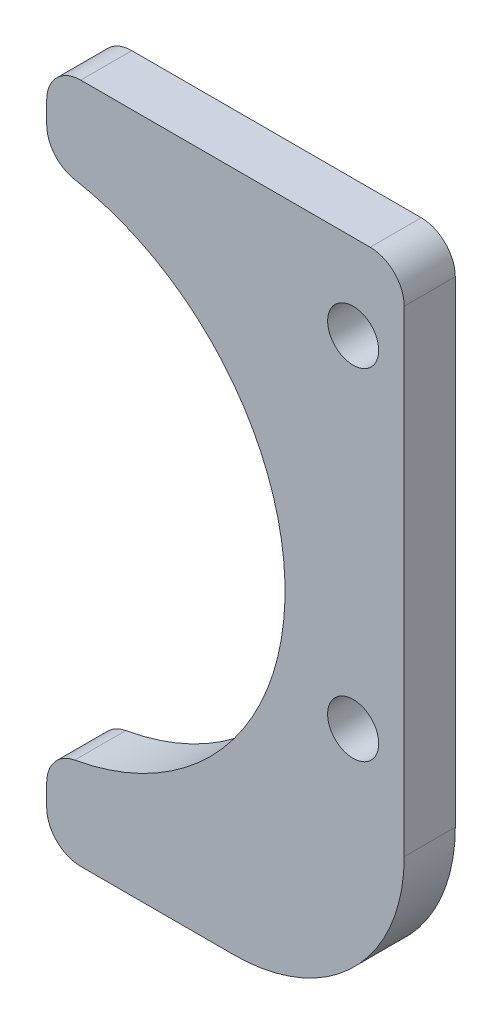
ISO-10303-21;
HEADER;
FILE_DESCRIPTION(('STEP AP214'),'2;1');
FILE_NAME('part.step','',(''),(''),'','','');
FILE_SCHEMA(('AUTOMOTIVE_DESIGN { 1 0 10303 214 1 1 1 1 }'));
ENDSEC;
DATA;
#1=APPLICATION_CONTEXT('core data for automotive mechanical design processes');
#2=APPLICATION_PROTOCOL_DEFINITION('international standard','automotive_design',2000,#1);
#3=PRODUCT_CONTEXT('',#1,'mechanical');
#4=PRODUCT('Part','Part','',(#3));
#5=PRODUCT_RELATED_PRODUCT_CATEGORY('part','',(#4));
#6=PRODUCT_DEFINITION_FORMATION('','',#4);
#7=PRODUCT_DEFINITION_CONTEXT('part definition',#1,'design');
#8=PRODUCT_DEFINITION('design','',#6,#7);
#9=PRODUCT_DEFINITION_SHAPE('','',#8);
#10=(LENGTH_UNIT() NAMED_UNIT(*) SI_UNIT(.MILLI.,.METRE.));
#11=(NAMED_UNIT(*) PLANE_ANGLE_UNIT() SI_UNIT($,.RADIAN.));
#12=(NAMED_UNIT(*) SI_UNIT($,.STERADIAN.) SOLID_ANGLE_UNIT());
#13=UNCERTAINTY_MEASURE_WITH_UNIT(LENGTH_MEASURE(1.E-05),#10,'distance_accuracy_value','');
#14=(GEOMETRIC_REPRESENTATION_CONTEXT(3) GLOBAL_UNCERTAINTY_ASSIGNED_CONTEXT((#13)) GLOBAL_UNIT_ASSIGNED_CONTEXT((#10,
#11,#12)) REPRESENTATION_CONTEXT('',''));
#15=CARTESIAN_POINT('',(0.,0.,0.));
#16=DIRECTION('',(0.,0.,1.));
#17=DIRECTION('',(1.,0.,0.));
#18=AXIS2_PLACEMENT_3D('',#15,#16,#17);
#19=CARTESIAN_POINT('',(1.00000000000001,20.,3.));
#20=DIRECTION('',(1.,0.,0.));
#21=DIRECTION('',(0.,1.,0.));
#22=AXIS2_PLACEMENT_3D('',#19,#20,#21);
#23=PLANE('',#22);
#24=DIRECTION('',(0.,-1.,0.));
#25=VECTOR('',#24,1.);
#26=CARTESIAN_POINT('',(1.00000000000001,20.,0.));
#27=LINE('',#26,#25);
#28=CARTESIAN_POINT('',(1.,18.,0.));
#29=VERTEX_POINT('',#28);
#30=CARTESIAN_POINT('',(1.,16.7332005306815,0.));
#31=VERTEX_POINT('',#30);
#32=EDGE_CURVE('E217',#29,#31,#27,.T.);
#33=ORIENTED_EDGE('',*,*,#32,.T.);
#34=DIRECTION('',(0.,0.,1.));
#35=VECTOR('',#34,1.);
#36=CARTESIAN_POINT('',(1.,16.7332005306815,3.));
#37=LINE('',#36,#35);
#38=CARTESIAN_POINT('',(1.,16.7332005306815,3.));
#39=VERTEX_POINT('',#38);
#40=EDGE_CURVE('E196',#31,#39,#37,.T.);
#41=ORIENTED_EDGE('',*,*,#40,.T.);
#42=DIRECTION('',(0.,-1.,0.));
#43=VECTOR('',#42,1.);
#44=CARTESIAN_POINT('',(1.00000000000001,20.,3.));
#45=LINE('',#44,#43);
#46=CARTESIAN_POINT('',(1.,18.,3.));
#47=VERTEX_POINT('',#46);
#48=EDGE_CURVE('E219',#47,#39,#45,.T.);
#49=ORIENTED_EDGE('',*,*,#48,.F.);
#50=DIRECTION('',(0.,0.,-1.));
#51=VECTOR('',#50,1.);
#52=CARTESIAN_POINT('',(1.,18.,0.));
#53=LINE('',#52,#51);
#54=EDGE_CURVE('E193',#47,#29,#53,.T.);
#55=ORIENTED_EDGE('',*,*,#54,.T.);
#56=EDGE_LOOP('',(#33,#41,#49,#55));
#57=FACE_BOUND('',#56,.T.);
#58=ADVANCED_FACE('F38',(#57),#23,.F.);
#59=CARTESIAN_POINT('',(0.,0.,3.));
#60=DIRECTION('',(0.,0.,-1.));
#61=DIRECTION('',(-1.,0.,0.));
#62=AXIS2_PLACEMENT_3D('',#59,#60,#61);
#63=CYLINDRICAL_SURFACE('',#62,15.);
#64=CARTESIAN_POINT('',(0.,0.,0.));
#65=DIRECTION('',(0.,0.,1.));
#66=DIRECTION('',(1.,0.,0.));
#67=AXIS2_PLACEMENT_3D('',#64,#65,#66);
#68=CIRCLE('',#67,15.);
#69=CARTESIAN_POINT('',(2.64705882352942,-14.7645887035425,0.));
#70=VERTEX_POINT('',#69);
#71=CARTESIAN_POINT('',(2.64705882352942,14.7645887035425,0.));
#72=VERTEX_POINT('',#71);
#73=EDGE_CURVE('E221',#70,#72,#68,.T.);
#74=ORIENTED_EDGE('',*,*,#73,.F.);
#75=DIRECTION('',(0.,0.,-1.));
#76=VECTOR('',#75,1.);
#77=CARTESIAN_POINT('',(2.64705882352942,-14.7645887035425,3.));
#78=LINE('',#77,#76);
#79=CARTESIAN_POINT('',(2.64705882352942,-14.7645887035425,3.));
#80=VERTEX_POINT('',#79);
#81=EDGE_CURVE('E60',#70,#80,#78,.F.);
#82=ORIENTED_EDGE('',*,*,#81,.T.);
#83=CARTESIAN_POINT('',(0.,0.,3.));
#84=DIRECTION('',(0.,0.,1.));
#85=DIRECTION('',(1.,0.,0.));
#86=AXIS2_PLACEMENT_3D('',#83,#84,#85);
#87=CIRCLE('',#86,15.);
#88=CARTESIAN_POINT('',(2.64705882352942,14.7645887035425,3.));
#89=VERTEX_POINT('',#88);
#90=EDGE_CURVE('E249',#80,#89,#87,.T.);
#91=ORIENTED_EDGE('',*,*,#90,.T.);
#92=DIRECTION('',(0.,0.,-1.));
#93=VECTOR('',#92,1.);
#94=CARTESIAN_POINT('',(2.64705882352942,14.7645887035425,3.));
#95=LINE('',#94,#93);
#96=EDGE_CURVE('E189',#89,#72,#95,.T.);
#97=ORIENTED_EDGE('',*,*,#96,.T.);
#98=EDGE_LOOP('',(#74,#82,#91,#97));
#99=FACE_BOUND('',#98,.T.);
#100=ADVANCED_FACE('F284',(#99),#63,.F.);
#101=CARTESIAN_POINT('',(1.,-14.9666295470958,3.));
#102=DIRECTION('',(1.,0.,0.));
#103=DIRECTION('',(0.,1.,0.));
#104=AXIS2_PLACEMENT_3D('',#101,#102,#103);
#105=PLANE('',#104);
#106=DIRECTION('',(0.,-1.,0.));
#107=VECTOR('',#106,1.);
#108=CARTESIAN_POINT('',(1.,-14.9666295470958,0.));
#109=LINE('',#108,#107);
#110=CARTESIAN_POINT('',(1.,-16.7332005306815,0.));
#111=VERTEX_POINT('',#110);
#112=CARTESIAN_POINT('',(1.,-18.,0.));
#113=VERTEX_POINT('',#112);
#114=EDGE_CURVE('E224',#111,#113,#109,.T.);
#115=ORIENTED_EDGE('',*,*,#114,.T.);
#116=DIRECTION('',(0.,0.,-1.));
#117=VECTOR('',#116,1.);
#118=CARTESIAN_POINT('',(1.,-18.,3.));
#119=LINE('',#118,#117);
#120=CARTESIAN_POINT('',(1.,-18.,3.));
#121=VERTEX_POINT('',#120);
#122=EDGE_CURVE('E178',#113,#121,#119,.F.);
#123=ORIENTED_EDGE('',*,*,#122,.T.);
#124=DIRECTION('',(0.,-1.,0.));
#125=VECTOR('',#124,1.);
#126=CARTESIAN_POINT('',(1.,-14.9666295470958,3.));
#127=LINE('',#126,#125);
#128=CARTESIAN_POINT('',(1.,-16.7332005306815,3.));
#129=VERTEX_POINT('',#128);
#130=EDGE_CURVE('E247',#129,#121,#127,.T.);
#131=ORIENTED_EDGE('',*,*,#130,.F.);
#132=DIRECTION('',(0.,0.,1.));
#133=VECTOR('',#132,1.);
#134=CARTESIAN_POINT('',(1.,-16.7332005306815,0.));
#135=LINE('',#134,#133);
#136=EDGE_CURVE('E175',#129,#111,#135,.F.);
#137=ORIENTED_EDGE('',*,*,#136,.T.);
#138=EDGE_LOOP('',(#115,#123,#131,#137));
#139=FACE_BOUND('',#138,.T.);
#140=ADVANCED_FACE('F241',(#139),#105,.F.);
#141=CARTESIAN_POINT('',(1.00000000000001,-20.,3.));
#142=DIRECTION('',(0.,1.,0.));
#143=DIRECTION('',(0.,0.,1.));
#144=AXIS2_PLACEMENT_3D('',#141,#142,#143);
#145=PLANE('',#144);
#146=DIRECTION('',(1.,0.,0.));
#147=VECTOR('',#146,1.);
#148=CARTESIAN_POINT('',(1.00000000000001,-20.,3.));
#149=LINE('',#148,#147);
#150=CARTESIAN_POINT('',(3.,-20.,3.));
#151=VERTEX_POINT('',#150);
#152=CARTESIAN_POINT('',(12.,-20.,3.));
#153=VERTEX_POINT('',#152);
#154=EDGE_CURVE('E246',#151,#153,#149,.T.);
#155=ORIENTED_EDGE('',*,*,#154,.F.);
#156=DIRECTION('',(0.,0.,-1.));
#157=VECTOR('',#156,1.);
#158=CARTESIAN_POINT('',(3.,-20.,3.));
#159=LINE('',#158,#157);
#160=CARTESIAN_POINT('',(3.,-20.,0.));
#161=VERTEX_POINT('',#160);
#162=EDGE_CURVE('E163',#151,#161,#159,.T.);
#163=ORIENTED_EDGE('',*,*,#162,.T.);
#164=DIRECTION('',(1.,0.,0.));
#165=VECTOR('',#164,1.);
#166=CARTESIAN_POINT('',(1.00000000000001,-20.,0.));
#167=LINE('',#166,#165);
#168=CARTESIAN_POINT('',(12.,-20.,0.));
#169=VERTEX_POINT('',#168);
#170=EDGE_CURVE('E140',#161,#169,#167,.T.);
#171=ORIENTED_EDGE('',*,*,#170,.T.);
#172=DIRECTION('',(0.,0.,-1.));
#173=VECTOR('',#172,1.);
#174=CARTESIAN_POINT('',(12.,-20.,3.));
#175=LINE('',#174,#173);
#176=EDGE_CURVE('E148',#169,#153,#175,.F.);
#177=ORIENTED_EDGE('',*,*,#176,.T.);
#178=EDGE_LOOP('',(#155,#163,#171,#177));
#179=FACE_BOUND('',#178,.T.);
#180=ADVANCED_FACE('F235',(#179),#145,.F.);
#181=CARTESIAN_POINT('',(22.,20.,3.));
#182=DIRECTION('',(1.,0.,0.));
#183=DIRECTION('',(0.,0.,-1.));
#184=AXIS2_PLACEMENT_3D('',#181,#182,#183);
#185=PLANE('',#184);
#186=DIRECTION('',(0.,-1.,0.));
#187=VECTOR('',#186,1.);
#188=CARTESIAN_POINT('',(22.,20.,0.));
#189=LINE('',#188,#187);
#190=CARTESIAN_POINT('',(22.,18.,0.));
#191=VERTEX_POINT('',#190);
#192=CARTESIAN_POINT('',(22.,-10.,0.));
#193=VERTEX_POINT('',#192);
#194=EDGE_CURVE('E128',#191,#193,#189,.T.);
#195=ORIENTED_EDGE('',*,*,#194,.F.);
#196=DIRECTION('',(0.,0.,-1.));
#197=VECTOR('',#196,1.);
#198=CARTESIAN_POINT('',(22.,18.,3.));
#199=LINE('',#198,#197);
#200=CARTESIAN_POINT('',(22.,18.,3.));
#201=VERTEX_POINT('',#200);
#202=EDGE_CURVE('E11',#191,#201,#199,.F.);
#203=ORIENTED_EDGE('',*,*,#202,.T.);
#204=DIRECTION('',(0.,-1.,0.));
#205=VECTOR('',#204,1.);
#206=CARTESIAN_POINT('',(22.,20.,3.));
#207=LINE('',#206,#205);
#208=CARTESIAN_POINT('',(22.,-10.,3.));
#209=VERTEX_POINT('',#208);
#210=EDGE_CURVE('E152',#201,#209,#207,.T.);
#211=ORIENTED_EDGE('',*,*,#210,.T.);
#212=DIRECTION('',(0.,0.,-1.));
#213=VECTOR('',#212,1.);
#214=CARTESIAN_POINT('',(22.,-10.,0.));
#215=LINE('',#214,#213);
#216=EDGE_CURVE('E146',#209,#193,#215,.T.);
#217=ORIENTED_EDGE('',*,*,#216,.T.);
#218=EDGE_LOOP('',(#195,#203,#211,#217));
#219=FACE_BOUND('',#218,.T.);
#220=ADVANCED_FACE('F150',(#219),#185,.T.);
#221=CARTESIAN_POINT('',(1.00000000000001,20.,3.));
#222=DIRECTION('',(0.,1.,0.));
#223=DIRECTION('',(0.,0.,1.));
#224=AXIS2_PLACEMENT_3D('',#221,#222,#223);
#225=PLANE('',#224);
#226=DIRECTION('',(1.,0.,0.));
#227=VECTOR('',#226,1.);
#228=CARTESIAN_POINT('',(1.00000000000001,20.,0.));
#229=LINE('',#228,#227);
#230=CARTESIAN_POINT('',(3.00000000000001,20.,0.));
#231=VERTEX_POINT('',#230);
#232=CARTESIAN_POINT('',(20.,20.,0.));
#233=VERTEX_POINT('',#232);
#234=EDGE_CURVE('E139',#231,#233,#229,.T.);
#235=ORIENTED_EDGE('',*,*,#234,.F.);
#236=DIRECTION('',(0.,0.,-1.));
#237=VECTOR('',#236,1.);
#238=CARTESIAN_POINT('',(3.,20.,3.));
#239=LINE('',#238,#237);
#240=CARTESIAN_POINT('',(3.00000000000001,20.,3.));
#241=VERTEX_POINT('',#240);
#242=EDGE_CURVE('E46',#231,#241,#239,.F.);
#243=ORIENTED_EDGE('',*,*,#242,.T.);
#244=DIRECTION('',(1.,0.,0.));
#245=VECTOR('',#244,1.);
#246=CARTESIAN_POINT('',(1.00000000000001,20.,3.));
#247=LINE('',#246,#245);
#248=CARTESIAN_POINT('',(20.,20.,3.));
#249=VERTEX_POINT('',#248);
#250=EDGE_CURVE('E154',#241,#249,#247,.T.);
#251=ORIENTED_EDGE('',*,*,#250,.T.);
#252=DIRECTION('',(0.,0.,-1.));
#253=VECTOR('',#252,1.);
#254=CARTESIAN_POINT('',(20.,20.,3.));
#255=LINE('',#254,#253);
#256=EDGE_CURVE('E198',#249,#233,#255,.T.);
#257=ORIENTED_EDGE('',*,*,#256,.T.);
#258=EDGE_LOOP('',(#235,#243,#251,#257));
#259=FACE_BOUND('',#258,.T.);
#260=ADVANCED_FACE('F204',(#259),#225,.T.);
#261=CARTESIAN_POINT('',(0.,0.,3.));
#262=DIRECTION('',(0.,0.,1.));
#263=DIRECTION('',(1.,0.,0.));
#264=AXIS2_PLACEMENT_3D('',#261,#262,#263);
#265=PLANE('',#264);
#266=CARTESIAN_POINT('',(19.,15.,3.));
#267=DIRECTION('',(0.,0.,1.));
#268=DIRECTION('',(1.,0.,0.));
#269=AXIS2_PLACEMENT_3D('',#266,#267,#268);
#270=CIRCLE('',#269,1.5);
#271=CARTESIAN_POINT('',(20.5,15.,3.));
#272=VERTEX_POINT('',#271);
#273=EDGE_CURVE('E227',#272,#272,#270,.T.);
#274=ORIENTED_EDGE('',*,*,#273,.F.);
#275=EDGE_LOOP('',(#274));
#276=FACE_BOUND('',#275,.T.);
#277=CARTESIAN_POINT('',(19.,-5.,3.));
#278=DIRECTION('',(0.,0.,1.));
#279=DIRECTION('',(1.,0.,0.));
#280=AXIS2_PLACEMENT_3D('',#277,#278,#279);
#281=CIRCLE('',#280,1.5);
#282=CARTESIAN_POINT('',(20.5,-5.,3.));
#283=VERTEX_POINT('',#282);
#284=EDGE_CURVE('E254',#283,#283,#281,.T.);
#285=ORIENTED_EDGE('',*,*,#284,.F.);
#286=EDGE_LOOP('',(#285));
#287=FACE_BOUND('',#286,.T.);
#288=ORIENTED_EDGE('',*,*,#130,.T.);
#289=CARTESIAN_POINT('',(3.,-18.,3.));
#290=DIRECTION('',(0.,0.,1.));
#291=DIRECTION('',(1.,0.,0.));
#292=AXIS2_PLACEMENT_3D('',#289,#290,#291);
#293=CIRCLE('',#292,2.);
#294=EDGE_CURVE('E187',#121,#151,#293,.T.);
#295=ORIENTED_EDGE('',*,*,#294,.T.);
#296=ORIENTED_EDGE('',*,*,#154,.T.);
#297=CARTESIAN_POINT('',(12.,-10.,3.));
#298=DIRECTION('',(0.,0.,1.));
#299=DIRECTION('',(1.,0.,0.));
#300=AXIS2_PLACEMENT_3D('',#297,#298,#299);
#301=CIRCLE('',#300,10.);
#302=EDGE_CURVE('E161',#153,#209,#301,.T.);
#303=ORIENTED_EDGE('',*,*,#302,.T.);
#304=ORIENTED_EDGE('',*,*,#210,.F.);
#305=CARTESIAN_POINT('',(20.,18.,3.));
#306=DIRECTION('',(0.,0.,1.));
#307=DIRECTION('',(1.,0.,0.));
#308=AXIS2_PLACEMENT_3D('',#305,#306,#307);
#309=CIRCLE('',#308,2.);
#310=EDGE_CURVE('E180',#201,#249,#309,.T.);
#311=ORIENTED_EDGE('',*,*,#310,.T.);
#312=ORIENTED_EDGE('',*,*,#250,.F.);
#313=CARTESIAN_POINT('',(3.,18.,3.));
#314=DIRECTION('',(0.,0.,1.));
#315=DIRECTION('',(1.,0.,0.));
#316=AXIS2_PLACEMENT_3D('',#313,#314,#315);
#317=CIRCLE('',#316,2.);
#318=EDGE_CURVE('E182',#241,#47,#317,.T.);
#319=ORIENTED_EDGE('',*,*,#318,.T.);
#320=ORIENTED_EDGE('',*,*,#48,.T.);
#321=CARTESIAN_POINT('',(3.,16.7332005306815,3.));
#322=DIRECTION('',(0.,0.,1.));
#323=DIRECTION('',(1.,0.,0.));
#324=AXIS2_PLACEMENT_3D('',#321,#322,#323);
#325=CIRCLE('',#324,2.);
#326=EDGE_CURVE('E53',#39,#89,#325,.T.);
#327=ORIENTED_EDGE('',*,*,#326,.T.);
#328=ORIENTED_EDGE('',*,*,#90,.F.);
#329=CARTESIAN_POINT('',(3.,-16.7332005306815,3.));
#330=DIRECTION('',(0.,0.,1.));
#331=DIRECTION('',(1.,0.,0.));
#332=AXIS2_PLACEMENT_3D('',#329,#330,#331);
#333=CIRCLE('',#332,2.);
#334=EDGE_CURVE('E185',#80,#129,#333,.T.);
#335=ORIENTED_EDGE('',*,*,#334,.T.);
#336=EDGE_LOOP('',(#288,#295,#296,#303,#304,#311,#312,#319,#320,#327,#328,#335));
#337=FACE_BOUND('',#336,.T.);
#338=ADVANCED_FACE('F209',(#276,#287,#337),#265,.T.);
#339=CARTESIAN_POINT('',(0.,0.,0.));
#340=DIRECTION('',(0.,0.,1.));
#341=DIRECTION('',(1.,0.,0.));
#342=AXIS2_PLACEMENT_3D('',#339,#340,#341);
#343=PLANE('',#342);
#344=CARTESIAN_POINT('',(19.,15.,0.));
#345=DIRECTION('',(0.,0.,1.));
#346=DIRECTION('',(1.,0.,0.));
#347=AXIS2_PLACEMENT_3D('',#344,#345,#346);
#348=CIRCLE('',#347,1.5);
#349=CARTESIAN_POINT('',(20.5,15.,0.));
#350=VERTEX_POINT('',#349);
#351=EDGE_CURVE('E222',#350,#350,#348,.T.);
#352=ORIENTED_EDGE('',*,*,#351,.T.);
#353=EDGE_LOOP('',(#352));
#354=FACE_BOUND('',#353,.T.);
#355=CARTESIAN_POINT('',(19.,-5.,0.));
#356=DIRECTION('',(0.,0.,1.));
#357=DIRECTION('',(1.,0.,0.));
#358=AXIS2_PLACEMENT_3D('',#355,#356,#357);
#359=CIRCLE('',#358,1.5);
#360=CARTESIAN_POINT('',(20.5,-5.,0.));
#361=VERTEX_POINT('',#360);
#362=EDGE_CURVE('E257',#361,#361,#359,.T.);
#363=ORIENTED_EDGE('',*,*,#362,.T.);
#364=EDGE_LOOP('',(#363));
#365=FACE_BOUND('',#364,.T.);
#366=ORIENTED_EDGE('',*,*,#170,.F.);
#367=CARTESIAN_POINT('',(3.,-18.,0.));
#368=DIRECTION('',(0.,0.,1.));
#369=DIRECTION('',(1.,0.,0.));
#370=AXIS2_PLACEMENT_3D('',#367,#368,#369);
#371=CIRCLE('',#370,2.);
#372=EDGE_CURVE('E173',#161,#113,#371,.F.);
#373=ORIENTED_EDGE('',*,*,#372,.T.);
#374=ORIENTED_EDGE('',*,*,#114,.F.);
#375=CARTESIAN_POINT('',(3.,-16.7332005306815,0.));
#376=DIRECTION('',(0.,0.,1.));
#377=DIRECTION('',(1.,0.,0.));
#378=AXIS2_PLACEMENT_3D('',#375,#376,#377);
#379=CIRCLE('',#378,2.);
#380=EDGE_CURVE('E171',#111,#70,#379,.F.);
#381=ORIENTED_EDGE('',*,*,#380,.T.);
#382=ORIENTED_EDGE('',*,*,#73,.T.);
#383=CARTESIAN_POINT('',(3.,16.7332005306815,0.));
#384=DIRECTION('',(0.,0.,1.));
#385=DIRECTION('',(1.,0.,0.));
#386=AXIS2_PLACEMENT_3D('',#383,#384,#385);
#387=CIRCLE('',#386,2.);
#388=EDGE_CURVE('E169',#72,#31,#387,.F.);
#389=ORIENTED_EDGE('',*,*,#388,.T.);
#390=ORIENTED_EDGE('',*,*,#32,.F.);
#391=CARTESIAN_POINT('',(3.,18.,0.));
#392=DIRECTION('',(0.,0.,1.));
#393=DIRECTION('',(1.,0.,0.));
#394=AXIS2_PLACEMENT_3D('',#391,#392,#393);
#395=CIRCLE('',#394,2.);
#396=EDGE_CURVE('E167',#29,#231,#395,.F.);
#397=ORIENTED_EDGE('',*,*,#396,.T.);
#398=ORIENTED_EDGE('',*,*,#234,.T.);
#399=CARTESIAN_POINT('',(20.,18.,0.));
#400=DIRECTION('',(0.,0.,1.));
#401=DIRECTION('',(1.,0.,0.));
#402=AXIS2_PLACEMENT_3D('',#399,#400,#401);
#403=CIRCLE('',#402,2.);
#404=EDGE_CURVE('E135',#233,#191,#403,.F.);
#405=ORIENTED_EDGE('',*,*,#404,.T.);
#406=ORIENTED_EDGE('',*,*,#194,.T.);
#407=CARTESIAN_POINT('',(12.,-10.,0.));
#408=DIRECTION('',(0.,0.,1.));
#409=DIRECTION('',(1.,0.,0.));
#410=AXIS2_PLACEMENT_3D('',#407,#408,#409);
#411=CIRCLE('',#410,10.);
#412=EDGE_CURVE('E132',#193,#169,#411,.F.);
#413=ORIENTED_EDGE('',*,*,#412,.T.);
#414=EDGE_LOOP('',(#366,#373,#374,#381,#382,#389,#390,#397,#398,#405,#406,#413));
#415=FACE_BOUND('',#414,.T.);
#416=ADVANCED_FACE('F131',(#354,#365,#415),#343,.F.);
#417=CARTESIAN_POINT('',(19.,-5.,0.));
#418=DIRECTION('',(0.,0.,1.));
#419=DIRECTION('',(1.,0.,0.));
#420=AXIS2_PLACEMENT_3D('',#417,#418,#419);
#421=CYLINDRICAL_SURFACE('',#420,1.5);
#422=ORIENTED_EDGE('',*,*,#362,.F.);
#423=EDGE_LOOP('',(#422));
#424=FACE_BOUND('',#423,.T.);
#425=ORIENTED_EDGE('',*,*,#284,.T.);
#426=EDGE_LOOP('',(#425));
#427=FACE_BOUND('',#426,.T.);
#428=ADVANCED_FACE('F270',(#424,#427),#421,.F.);
#429=CARTESIAN_POINT('',(19.,15.,0.));
#430=DIRECTION('',(0.,0.,1.));
#431=DIRECTION('',(1.,0.,0.));
#432=AXIS2_PLACEMENT_3D('',#429,#430,#431);
#433=CYLINDRICAL_SURFACE('',#432,1.5);
#434=ORIENTED_EDGE('',*,*,#351,.F.);
#435=EDGE_LOOP('',(#434));
#436=FACE_BOUND('',#435,.T.);
#437=ORIENTED_EDGE('',*,*,#273,.T.);
#438=EDGE_LOOP('',(#437));
#439=FACE_BOUND('',#438,.T.);
#440=ADVANCED_FACE('F263',(#436,#439),#433,.F.);
#441=CARTESIAN_POINT('',(12.,-10.,3.));
#442=DIRECTION('',(0.,0.,1.));
#443=DIRECTION('',(1.,0.,0.));
#444=AXIS2_PLACEMENT_3D('',#441,#442,#443);
#445=CYLINDRICAL_SURFACE('',#444,10.);
#446=ORIENTED_EDGE('',*,*,#302,.F.);
#447=ORIENTED_EDGE('',*,*,#176,.F.);
#448=ORIENTED_EDGE('',*,*,#412,.F.);
#449=ORIENTED_EDGE('',*,*,#216,.F.);
#450=EDGE_LOOP('',(#446,#447,#448,#449));
#451=FACE_BOUND('',#450,.T.);
#452=ADVANCED_FACE('F145',(#451),#445,.T.);
#453=CARTESIAN_POINT('',(3.,-18.,3.));
#454=DIRECTION('',(0.,0.,-1.));
#455=DIRECTION('',(-1.,0.,0.));
#456=AXIS2_PLACEMENT_3D('',#453,#454,#455);
#457=CYLINDRICAL_SURFACE('',#456,2.);
#458=ORIENTED_EDGE('',*,*,#294,.F.);
#459=ORIENTED_EDGE('',*,*,#122,.F.);
#460=ORIENTED_EDGE('',*,*,#372,.F.);
#461=ORIENTED_EDGE('',*,*,#162,.F.);
#462=EDGE_LOOP('',(#458,#459,#460,#461));
#463=FACE_BOUND('',#462,.T.);
#464=ADVANCED_FACE('F245',(#463),#457,.T.);
#465=CARTESIAN_POINT('',(3.,-16.7332005306815,3.));
#466=DIRECTION('',(0.,0.,-1.));
#467=DIRECTION('',(-1.,0.,0.));
#468=AXIS2_PLACEMENT_3D('',#465,#466,#467);
#469=CYLINDRICAL_SURFACE('',#468,2.);
#470=ORIENTED_EDGE('',*,*,#334,.F.);
#471=ORIENTED_EDGE('',*,*,#81,.F.);
#472=ORIENTED_EDGE('',*,*,#380,.F.);
#473=ORIENTED_EDGE('',*,*,#136,.F.);
#474=EDGE_LOOP('',(#470,#471,#472,#473));
#475=FACE_BOUND('',#474,.T.);
#476=ADVANCED_FACE('F296',(#475),#469,.T.);
#477=CARTESIAN_POINT('',(3.,16.7332005306815,3.));
#478=DIRECTION('',(0.,0.,-1.));
#479=DIRECTION('',(-1.,0.,0.));
#480=AXIS2_PLACEMENT_3D('',#477,#478,#479);
#481=CYLINDRICAL_SURFACE('',#480,2.);
#482=ORIENTED_EDGE('',*,*,#326,.F.);
#483=ORIENTED_EDGE('',*,*,#40,.F.);
#484=ORIENTED_EDGE('',*,*,#388,.F.);
#485=ORIENTED_EDGE('',*,*,#96,.F.);
#486=EDGE_LOOP('',(#482,#483,#484,#485));
#487=FACE_BOUND('',#486,.T.);
#488=ADVANCED_FACE('F299',(#487),#481,.T.);
#489=CARTESIAN_POINT('',(3.,18.,3.));
#490=DIRECTION('',(0.,0.,1.));
#491=DIRECTION('',(1.,0.,0.));
#492=AXIS2_PLACEMENT_3D('',#489,#490,#491);
#493=CYLINDRICAL_SURFACE('',#492,2.);
#494=ORIENTED_EDGE('',*,*,#318,.F.);
#495=ORIENTED_EDGE('',*,*,#242,.F.);
#496=ORIENTED_EDGE('',*,*,#396,.F.);
#497=ORIENTED_EDGE('',*,*,#54,.F.);
#498=EDGE_LOOP('',(#494,#495,#496,#497));
#499=FACE_BOUND('',#498,.T.);
#500=ADVANCED_FACE('F213',(#499),#493,.T.);
#501=CARTESIAN_POINT('',(20.,18.,3.));
#502=DIRECTION('',(0.,0.,-1.));
#503=DIRECTION('',(-1.,0.,0.));
#504=AXIS2_PLACEMENT_3D('',#501,#502,#503);
#505=CYLINDRICAL_SURFACE('',#504,2.);
#506=ORIENTED_EDGE('',*,*,#310,.F.);
#507=ORIENTED_EDGE('',*,*,#202,.F.);
#508=ORIENTED_EDGE('',*,*,#404,.F.);
#509=ORIENTED_EDGE('',*,*,#256,.F.);
#510=EDGE_LOOP('',(#506,#507,#508,#509));
#511=FACE_BOUND('',#510,.T.);
#512=ADVANCED_FACE('F40',(#511),#505,.T.);
#513=CLOSED_SHELL('',(#58,#100,#140,#180,#220,#260,#338,#416,#428,#440,#452,#464,#476,#488,#500,#512));
#514=MANIFOLD_SOLID_BREP('B2',#513);
#515=ADVANCED_BREP_SHAPE_REPRESENTATION('',(#18,#514),#14);
#516=SHAPE_DEFINITION_REPRESENTATION(#9,#515);
ENDSEC;
END-ISO-10303-21;
